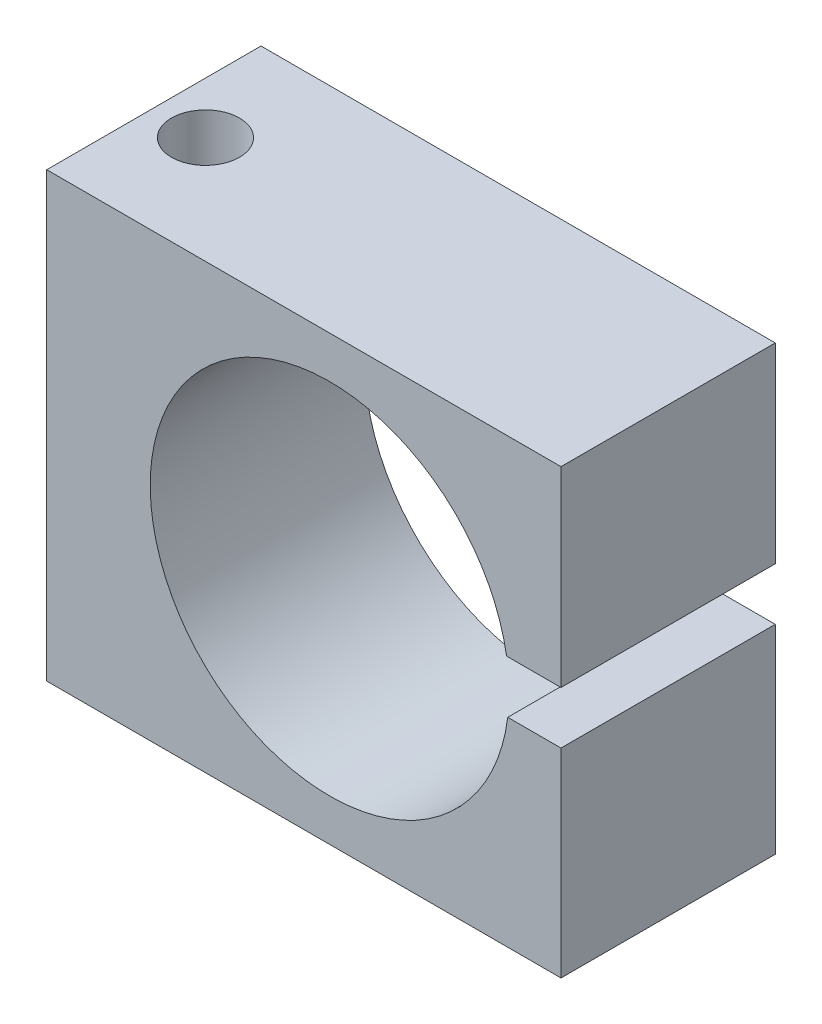
ISO-10303-21;
HEADER;
FILE_DESCRIPTION(('STEP AP214'),'2;1');
FILE_NAME('part.step','',(''),(''),'','','');
FILE_SCHEMA(('AUTOMOTIVE_DESIGN { 1 0 10303 214 1 1 1 1 }'));
ENDSEC;
DATA;
#1=APPLICATION_CONTEXT('core data for automotive mechanical design processes');
#2=APPLICATION_PROTOCOL_DEFINITION('international standard','automotive_design',2000,#1);
#3=PRODUCT_CONTEXT('',#1,'mechanical');
#4=PRODUCT('Part','Part','',(#3));
#5=PRODUCT_RELATED_PRODUCT_CATEGORY('part','',(#4));
#6=PRODUCT_DEFINITION_FORMATION('','',#4);
#7=PRODUCT_DEFINITION_CONTEXT('part definition',#1,'design');
#8=PRODUCT_DEFINITION('design','',#6,#7);
#9=PRODUCT_DEFINITION_SHAPE('','',#8);
#10=(LENGTH_UNIT() NAMED_UNIT(*) SI_UNIT(.MILLI.,.METRE.));
#11=(NAMED_UNIT(*) PLANE_ANGLE_UNIT() SI_UNIT($,.RADIAN.));
#12=(NAMED_UNIT(*) SI_UNIT($,.STERADIAN.) SOLID_ANGLE_UNIT());
#13=UNCERTAINTY_MEASURE_WITH_UNIT(LENGTH_MEASURE(1.E-05),#10,'distance_accuracy_value','');
#14=(GEOMETRIC_REPRESENTATION_CONTEXT(3) GLOBAL_UNCERTAINTY_ASSIGNED_CONTEXT((#13)) GLOBAL_UNIT_ASSIGNED_CONTEXT((#10,
#11,#12)) REPRESENTATION_CONTEXT('',''));
#15=CARTESIAN_POINT('',(0.,0.,0.));
#16=DIRECTION('',(0.,0.,1.));
#17=DIRECTION('',(1.,0.,0.));
#18=AXIS2_PLACEMENT_3D('',#15,#16,#17);
#19=CARTESIAN_POINT('',(-31.3348228081609,-15.6674114040805,20.));
#20=DIRECTION('',(-1.,0.,0.));
#21=DIRECTION('',(0.,0.,1.));
#22=AXIS2_PLACEMENT_3D('',#19,#20,#21);
#23=PLANE('',#22);
#24=DIRECTION('',(0.,1.,0.));
#25=VECTOR('',#24,1.);
#26=CARTESIAN_POINT('',(-31.3348228081609,-15.6674114040805,0.));
#27=LINE('',#26,#25);
#28=CARTESIAN_POINT('',(-31.3348228081609,-20.6674114040805,0.));
#29=VERTEX_POINT('',#28);
#30=CARTESIAN_POINT('',(-31.3348228081609,20.6674114040805,0.));
#31=VERTEX_POINT('',#30);
#32=EDGE_CURVE('E121',#29,#31,#27,.T.);
#33=ORIENTED_EDGE('',*,*,#32,.F.);
#34=DIRECTION('',(0.,0.,-1.));
#35=VECTOR('',#34,1.);
#36=CARTESIAN_POINT('',(-31.3348228081609,-20.6674114040805,20.));
#37=LINE('',#36,#35);
#38=CARTESIAN_POINT('',(-31.3348228081609,-20.6674114040805,20.));
#39=VERTEX_POINT('',#38);
#40=EDGE_CURVE('E129',#39,#29,#37,.T.);
#41=ORIENTED_EDGE('',*,*,#40,.F.);
#42=DIRECTION('',(0.,1.,0.));
#43=VECTOR('',#42,1.);
#44=CARTESIAN_POINT('',(-31.3348228081609,-15.6674114040805,20.));
#45=LINE('',#44,#43);
#46=CARTESIAN_POINT('',(-31.3348228081609,20.6674114040805,20.));
#47=VERTEX_POINT('',#46);
#48=EDGE_CURVE('E43',#39,#47,#45,.T.);
#49=ORIENTED_EDGE('',*,*,#48,.T.);
#50=DIRECTION('',(0.,0.,1.));
#51=VECTOR('',#50,1.);
#52=CARTESIAN_POINT('',(-31.3348228081609,20.6674114040805,20.));
#53=LINE('',#52,#51);
#54=EDGE_CURVE('E125',#31,#47,#53,.T.);
#55=ORIENTED_EDGE('',*,*,#54,.F.);
#56=EDGE_LOOP('',(#33,#41,#49,#55));
#57=FACE_BOUND('',#56,.T.);
#58=ADVANCED_FACE('F36',(#57),#23,.T.);
#59=CARTESIAN_POINT('',(0.,0.,20.));
#60=DIRECTION('',(0.,0.,-1.));
#61=DIRECTION('',(-1.,0.,0.));
#62=AXIS2_PLACEMENT_3D('',#59,#60,#61);
#63=PLANE('',#62);
#64=DIRECTION('',(1.,0.,0.));
#65=VECTOR('',#64,1.);
#66=CARTESIAN_POINT('',(3.61700258551024,-2.07893540389214,20.));
#67=LINE('',#66,#65);
#68=CARTESIAN_POINT('',(11.6948700025142,-2.07893540389214,20.));
#69=VERTEX_POINT('',#68);
#70=CARTESIAN_POINT('',(16.6651771918391,-2.07893540389213,20.));
#71=VERTEX_POINT('',#70);
#72=EDGE_CURVE('E107',#69,#71,#67,.T.);
#73=ORIENTED_EDGE('',*,*,#72,.F.);
#74=CARTESIAN_POINT('',(-4.92561517651846,0.,20.));
#75=DIRECTION('',(0.,0.,1.));
#76=DIRECTION('',(1.,0.,0.));
#77=AXIS2_PLACEMENT_3D('',#74,#75,#76);
#78=CIRCLE('',#77,16.75);
#79=CARTESIAN_POINT('',(11.5861966207284,2.8147062319713,20.));
#80=VERTEX_POINT('',#79);
#81=EDGE_CURVE('E99',#80,#69,#78,.T.);
#82=ORIENTED_EDGE('',*,*,#81,.F.);
#83=DIRECTION('',(-1.,0.,0.));
#84=VECTOR('',#83,1.);
#85=CARTESIAN_POINT('',(8.6651771918391,2.8147062319713,20.));
#86=LINE('',#85,#84);
#87=CARTESIAN_POINT('',(16.6651771918391,2.8147062319713,20.));
#88=VERTEX_POINT('',#87);
#89=EDGE_CURVE('E105',#88,#80,#86,.T.);
#90=ORIENTED_EDGE('',*,*,#89,.F.);
#91=DIRECTION('',(0.,-1.,0.));
#92=VECTOR('',#91,1.);
#93=CARTESIAN_POINT('',(16.6651771918391,15.6674114040805,20.));
#94=LINE('',#93,#92);
#95=CARTESIAN_POINT('',(16.6651771918391,20.6674114040805,20.));
#96=VERTEX_POINT('',#95);
#97=EDGE_CURVE('E167',#96,#88,#94,.T.);
#98=ORIENTED_EDGE('',*,*,#97,.F.);
#99=DIRECTION('',(1.,0.,0.));
#100=VECTOR('',#99,1.);
#101=CARTESIAN_POINT('',(-31.3348228081609,20.6674114040805,20.));
#102=LINE('',#101,#100);
#103=EDGE_CURVE('E150',#47,#96,#102,.T.);
#104=ORIENTED_EDGE('',*,*,#103,.F.);
#105=ORIENTED_EDGE('',*,*,#48,.F.);
#106=DIRECTION('',(-1.,0.,0.));
#107=VECTOR('',#106,1.);
#108=CARTESIAN_POINT('',(-31.3348228081609,-20.6674114040805,20.));
#109=LINE('',#108,#107);
#110=CARTESIAN_POINT('',(16.6651771918391,-20.6674114040805,20.));
#111=VERTEX_POINT('',#110);
#112=EDGE_CURVE('E126',#111,#39,#109,.T.);
#113=ORIENTED_EDGE('',*,*,#112,.F.);
#114=DIRECTION('',(0.,-1.,0.));
#115=VECTOR('',#114,1.);
#116=CARTESIAN_POINT('',(16.6651771918391,-2.07893540389213,20.));
#117=LINE('',#116,#115);
#118=EDGE_CURVE('E159',#71,#111,#117,.T.);
#119=ORIENTED_EDGE('',*,*,#118,.F.);
#120=EDGE_LOOP('',(#73,#82,#90,#98,#104,#105,#113,#119));
#121=FACE_BOUND('',#120,.T.);
#122=ADVANCED_FACE('F104',(#121),#63,.F.);
#123=CARTESIAN_POINT('',(0.,0.,0.));
#124=DIRECTION('',(0.,0.,-1.));
#125=DIRECTION('',(-1.,0.,0.));
#126=AXIS2_PLACEMENT_3D('',#123,#124,#125);
#127=PLANE('',#126);
#128=CARTESIAN_POINT('',(-4.92561517651846,0.,0.));
#129=DIRECTION('',(0.,0.,-1.));
#130=DIRECTION('',(-1.,0.,0.));
#131=AXIS2_PLACEMENT_3D('',#128,#129,#130);
#132=CIRCLE('',#131,16.75);
#133=CARTESIAN_POINT('',(11.6948700025142,-2.07893540389214,0.));
#134=VERTEX_POINT('',#133);
#135=CARTESIAN_POINT('',(11.5861966207284,2.8147062319713,0.));
#136=VERTEX_POINT('',#135);
#137=EDGE_CURVE('E50',#134,#136,#132,.T.);
#138=ORIENTED_EDGE('',*,*,#137,.F.);
#139=DIRECTION('',(1.,0.,0.));
#140=VECTOR('',#139,1.);
#141=CARTESIAN_POINT('',(3.61700258551024,-2.07893540389214,0.));
#142=LINE('',#141,#140);
#143=CARTESIAN_POINT('',(16.6651771918391,-2.07893540389213,0.));
#144=VERTEX_POINT('',#143);
#145=EDGE_CURVE('E117',#134,#144,#142,.T.);
#146=ORIENTED_EDGE('',*,*,#145,.T.);
#147=DIRECTION('',(0.,1.,0.));
#148=VECTOR('',#147,1.);
#149=CARTESIAN_POINT('',(16.6651771918391,-2.07893540389213,0.));
#150=LINE('',#149,#148);
#151=CARTESIAN_POINT('',(16.6651771918391,-20.6674114040805,0.));
#152=VERTEX_POINT('',#151);
#153=EDGE_CURVE('E161',#152,#144,#150,.T.);
#154=ORIENTED_EDGE('',*,*,#153,.F.);
#155=DIRECTION('',(1.,0.,0.));
#156=VECTOR('',#155,1.);
#157=CARTESIAN_POINT('',(-31.3348228081609,-20.6674114040805,0.));
#158=LINE('',#157,#156);
#159=EDGE_CURVE('E134',#29,#152,#158,.T.);
#160=ORIENTED_EDGE('',*,*,#159,.F.);
#161=ORIENTED_EDGE('',*,*,#32,.T.);
#162=DIRECTION('',(-1.,0.,0.));
#163=VECTOR('',#162,1.);
#164=CARTESIAN_POINT('',(-31.3348228081609,20.6674114040805,0.));
#165=LINE('',#164,#163);
#166=CARTESIAN_POINT('',(16.6651771918391,20.6674114040805,0.));
#167=VERTEX_POINT('',#166);
#168=EDGE_CURVE('E156',#167,#31,#165,.T.);
#169=ORIENTED_EDGE('',*,*,#168,.F.);
#170=DIRECTION('',(0.,1.,0.));
#171=VECTOR('',#170,1.);
#172=CARTESIAN_POINT('',(16.6651771918391,15.6674114040805,0.));
#173=LINE('',#172,#171);
#174=CARTESIAN_POINT('',(16.6651771918391,2.8147062319713,0.));
#175=VERTEX_POINT('',#174);
#176=EDGE_CURVE('E112',#175,#167,#173,.T.);
#177=ORIENTED_EDGE('',*,*,#176,.F.);
#178=DIRECTION('',(-1.,0.,0.));
#179=VECTOR('',#178,1.);
#180=CARTESIAN_POINT('',(8.6651771918391,2.8147062319713,0.));
#181=LINE('',#180,#179);
#182=EDGE_CURVE('E56',#175,#136,#181,.T.);
#183=ORIENTED_EDGE('',*,*,#182,.T.);
#184=EDGE_LOOP('',(#138,#146,#154,#160,#161,#169,#177,#183));
#185=FACE_BOUND('',#184,.T.);
#186=ADVANCED_FACE('F171',(#185),#127,.T.);
#187=CARTESIAN_POINT('',(3.61700258551024,-2.07893540389214,0.));
#188=DIRECTION('',(0.,-1.,0.));
#189=DIRECTION('',(0.,0.,-1.));
#190=AXIS2_PLACEMENT_3D('',#187,#188,#189);
#191=PLANE('',#190);
#192=ORIENTED_EDGE('',*,*,#145,.F.);
#193=DIRECTION('',(0.,0.,1.));
#194=VECTOR('',#193,1.);
#195=CARTESIAN_POINT('',(11.6948700025142,-2.07893540389214,-28.));
#196=LINE('',#195,#194);
#197=EDGE_CURVE('E130',#134,#69,#196,.T.);
#198=ORIENTED_EDGE('',*,*,#197,.T.);
#199=ORIENTED_EDGE('',*,*,#72,.T.);
#200=DIRECTION('',(0.,0.,1.));
#201=VECTOR('',#200,1.);
#202=CARTESIAN_POINT('',(16.6651771918391,-2.07893540389213,20.));
#203=LINE('',#202,#201);
#204=EDGE_CURVE('E164',#144,#71,#203,.T.);
#205=ORIENTED_EDGE('',*,*,#204,.F.);
#206=EDGE_LOOP('',(#192,#198,#199,#205));
#207=FACE_BOUND('',#206,.T.);
#208=ADVANCED_FACE('F177',(#207),#191,.F.);
#209=CARTESIAN_POINT('',(8.6651771918391,2.8147062319713,0.));
#210=DIRECTION('',(0.,1.,0.));
#211=DIRECTION('',(0.,0.,1.));
#212=AXIS2_PLACEMENT_3D('',#209,#210,#211);
#213=PLANE('',#212);
#214=ORIENTED_EDGE('',*,*,#89,.T.);
#215=DIRECTION('',(0.,0.,1.));
#216=VECTOR('',#215,1.);
#217=CARTESIAN_POINT('',(11.5861966207284,2.8147062319713,-28.));
#218=LINE('',#217,#216);
#219=EDGE_CURVE('E11',#80,#136,#218,.F.);
#220=ORIENTED_EDGE('',*,*,#219,.T.);
#221=ORIENTED_EDGE('',*,*,#182,.F.);
#222=DIRECTION('',(0.,0.,-1.));
#223=VECTOR('',#222,1.);
#224=CARTESIAN_POINT('',(16.6651771918391,2.8147062319713,20.));
#225=LINE('',#224,#223);
#226=EDGE_CURVE('E110',#88,#175,#225,.T.);
#227=ORIENTED_EDGE('',*,*,#226,.F.);
#228=EDGE_LOOP('',(#214,#220,#221,#227));
#229=FACE_BOUND('',#228,.T.);
#230=ADVANCED_FACE('F109',(#229),#213,.F.);
#231=CARTESIAN_POINT('',(-26.5185584301262,15.6674114040805,10.));
#232=DIRECTION('',(0.,1.,0.));
#233=DIRECTION('',(0.,0.,1.));
#234=AXIS2_PLACEMENT_3D('',#231,#232,#233);
#235=CYLINDRICAL_SURFACE('',#234,3.17500000000001);
#236=CARTESIAN_POINT('',(-26.5185584301262,20.6674114040805,10.));
#237=DIRECTION('',(0.,-1.,0.));
#238=DIRECTION('',(0.,0.,-1.));
#239=AXIS2_PLACEMENT_3D('',#236,#237,#238);
#240=CIRCLE('',#239,3.17500000000001);
#241=CARTESIAN_POINT('',(-26.5185584301262,20.6674114040805,6.82499999999999));
#242=VERTEX_POINT('',#241);
#243=EDGE_CURVE('E123',#242,#242,#240,.T.);
#244=ORIENTED_EDGE('',*,*,#243,.F.);
#245=EDGE_LOOP('',(#244));
#246=FACE_BOUND('',#245,.T.);
#247=CARTESIAN_POINT('',(-26.5185584301262,-20.6674114040805,10.));
#248=DIRECTION('',(0.,-1.,0.));
#249=DIRECTION('',(0.,0.,-1.));
#250=AXIS2_PLACEMENT_3D('',#247,#248,#249);
#251=CIRCLE('',#250,3.17500000000001);
#252=CARTESIAN_POINT('',(-26.5185584301262,-20.6674114040805,6.82499999999999));
#253=VERTEX_POINT('',#252);
#254=EDGE_CURVE('E127',#253,#253,#251,.T.);
#255=ORIENTED_EDGE('',*,*,#254,.T.);
#256=EDGE_LOOP('',(#255));
#257=FACE_BOUND('',#256,.T.);
#258=ADVANCED_FACE('F184',(#246,#257),#235,.F.);
#259=CARTESIAN_POINT('',(16.6651771918391,0.,0.));
#260=DIRECTION('',(1.,0.,0.));
#261=DIRECTION('',(0.,0.,-1.));
#262=AXIS2_PLACEMENT_3D('',#259,#260,#261);
#263=PLANE('',#262);
#264=ORIENTED_EDGE('',*,*,#97,.T.);
#265=ORIENTED_EDGE('',*,*,#226,.T.);
#266=ORIENTED_EDGE('',*,*,#176,.T.);
#267=DIRECTION('',(0.,0.,-1.));
#268=VECTOR('',#267,1.);
#269=CARTESIAN_POINT('',(16.6651771918391,20.6674114040805,20.));
#270=LINE('',#269,#268);
#271=EDGE_CURVE('E153',#96,#167,#270,.T.);
#272=ORIENTED_EDGE('',*,*,#271,.F.);
#273=EDGE_LOOP('',(#264,#265,#266,#272));
#274=FACE_BOUND('',#273,.T.);
#275=ADVANCED_FACE('F204',(#274),#263,.T.);
#276=CARTESIAN_POINT('',(16.6651771918391,0.,0.));
#277=DIRECTION('',(1.,0.,0.));
#278=DIRECTION('',(0.,0.,-1.));
#279=AXIS2_PLACEMENT_3D('',#276,#277,#278);
#280=PLANE('',#279);
#281=ORIENTED_EDGE('',*,*,#118,.T.);
#282=DIRECTION('',(0.,0.,1.));
#283=VECTOR('',#282,1.);
#284=CARTESIAN_POINT('',(16.6651771918391,-20.6674114040805,20.));
#285=LINE('',#284,#283);
#286=EDGE_CURVE('E143',#152,#111,#285,.T.);
#287=ORIENTED_EDGE('',*,*,#286,.F.);
#288=ORIENTED_EDGE('',*,*,#153,.T.);
#289=ORIENTED_EDGE('',*,*,#204,.T.);
#290=EDGE_LOOP('',(#281,#287,#288,#289));
#291=FACE_BOUND('',#290,.T.);
#292=ADVANCED_FACE('F176',(#291),#280,.T.);
#293=CARTESIAN_POINT('',(0.,20.6674114040805,0.));
#294=DIRECTION('',(0.,-1.,0.));
#295=DIRECTION('',(0.,0.,-1.));
#296=AXIS2_PLACEMENT_3D('',#293,#294,#295);
#297=PLANE('',#296);
#298=ORIENTED_EDGE('',*,*,#243,.T.);
#299=EDGE_LOOP('',(#298));
#300=FACE_BOUND('',#299,.T.);
#301=ORIENTED_EDGE('',*,*,#54,.T.);
#302=ORIENTED_EDGE('',*,*,#103,.T.);
#303=ORIENTED_EDGE('',*,*,#271,.T.);
#304=ORIENTED_EDGE('',*,*,#168,.T.);
#305=EDGE_LOOP('',(#301,#302,#303,#304));
#306=FACE_BOUND('',#305,.T.);
#307=ADVANCED_FACE('F202',(#300,#306),#297,.F.);
#308=CARTESIAN_POINT('',(0.,-20.6674114040805,0.));
#309=DIRECTION('',(0.,-1.,0.));
#310=DIRECTION('',(0.,0.,-1.));
#311=AXIS2_PLACEMENT_3D('',#308,#309,#310);
#312=PLANE('',#311);
#313=ORIENTED_EDGE('',*,*,#254,.F.);
#314=EDGE_LOOP('',(#313));
#315=FACE_BOUND('',#314,.T.);
#316=ORIENTED_EDGE('',*,*,#40,.T.);
#317=ORIENTED_EDGE('',*,*,#159,.T.);
#318=ORIENTED_EDGE('',*,*,#286,.T.);
#319=ORIENTED_EDGE('',*,*,#112,.T.);
#320=EDGE_LOOP('',(#316,#317,#318,#319));
#321=FACE_BOUND('',#320,.T.);
#322=ADVANCED_FACE('F197',(#315,#321),#312,.T.);
#323=CARTESIAN_POINT('',(-4.92561517651846,0.,-28.));
#324=DIRECTION('',(0.,0.,1.));
#325=DIRECTION('',(1.,0.,0.));
#326=AXIS2_PLACEMENT_3D('',#323,#324,#325);
#327=CYLINDRICAL_SURFACE('',#326,16.75);
#328=ORIENTED_EDGE('',*,*,#137,.T.);
#329=ORIENTED_EDGE('',*,*,#219,.F.);
#330=ORIENTED_EDGE('',*,*,#81,.T.);
#331=ORIENTED_EDGE('',*,*,#197,.F.);
#332=EDGE_LOOP('',(#328,#329,#330,#331));
#333=FACE_BOUND('',#332,.T.);
#334=ADVANCED_FACE('F98',(#333),#327,.F.);
#335=CLOSED_SHELL('',(#58,#122,#186,#208,#230,#258,#275,#292,#307,#322,#334));
#336=MANIFOLD_SOLID_BREP('B2',#335);
#337=ADVANCED_BREP_SHAPE_REPRESENTATION('',(#18,#336),#14);
#338=SHAPE_DEFINITION_REPRESENTATION(#9,#337);
ENDSEC;
END-ISO-10303-21;
